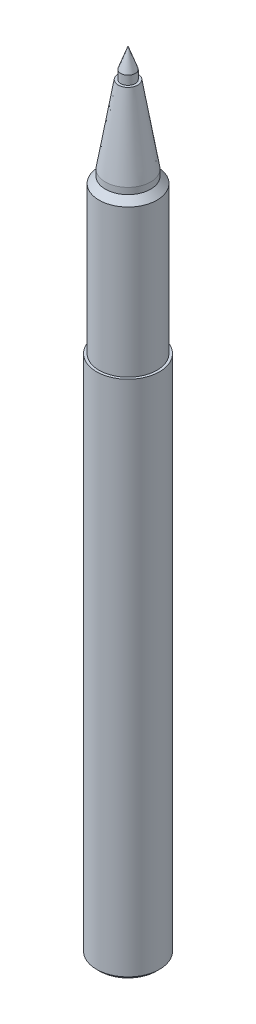
ISO-10303-21;
HEADER;
FILE_DESCRIPTION(('STEP AP214'),'2;1');
FILE_NAME('part.step','',(''),(''),'','','');
FILE_SCHEMA(('AUTOMOTIVE_DESIGN { 1 0 10303 214 1 1 1 1 }'));
ENDSEC;
DATA;
#1=APPLICATION_CONTEXT('core data for automotive mechanical design processes');
#2=APPLICATION_PROTOCOL_DEFINITION('international standard','automotive_design',2000,#1);
#3=PRODUCT_CONTEXT('',#1,'mechanical');
#4=PRODUCT('Part','Part','',(#3));
#5=PRODUCT_RELATED_PRODUCT_CATEGORY('part','',(#4));
#6=PRODUCT_DEFINITION_FORMATION('','',#4);
#7=PRODUCT_DEFINITION_CONTEXT('part definition',#1,'design');
#8=PRODUCT_DEFINITION('design','',#6,#7);
#9=PRODUCT_DEFINITION_SHAPE('','',#8);
#10=(LENGTH_UNIT() NAMED_UNIT(*) SI_UNIT(.MILLI.,.METRE.));
#11=(NAMED_UNIT(*) PLANE_ANGLE_UNIT() SI_UNIT($,.RADIAN.));
#12=(NAMED_UNIT(*) SI_UNIT($,.STERADIAN.) SOLID_ANGLE_UNIT());
#13=UNCERTAINTY_MEASURE_WITH_UNIT(LENGTH_MEASURE(1.E-05),#10,'distance_accuracy_value','');
#14=(GEOMETRIC_REPRESENTATION_CONTEXT(3) GLOBAL_UNCERTAINTY_ASSIGNED_CONTEXT((#13)) GLOBAL_UNIT_ASSIGNED_CONTEXT((#10,
#11,#12)) REPRESENTATION_CONTEXT('',''));
#15=CARTESIAN_POINT('',(0.,0.,0.));
#16=DIRECTION('',(0.,0.,1.));
#17=DIRECTION('',(1.,0.,0.));
#18=AXIS2_PLACEMENT_3D('',#15,#16,#17);
#19=CARTESIAN_POINT('',(-3.9241122024751E-13,114.397298964295,0.));
#20=DIRECTION('',(0.,-1.,0.));
#21=DIRECTION('',(1.,0.,0.));
#22=AXIS2_PLACEMENT_3D('',#19,#20,#21);
#23=CONICAL_SURFACE('',#22,4.16333634234434E-13,0.34500217720683);
#24=CARTESIAN_POINT('',(-3.81434423451072E-13,111.197298964294,0.));
#25=DIRECTION('',(0.,-1.,0.));
#26=DIRECTION('',(1.,0.,0.));
#27=AXIS2_PLACEMENT_3D('',#24,#25,#26);
#28=CIRCLE('',#27,1.14999999999962);
#29=CARTESIAN_POINT('',(1.14999999999923,111.197298964294,0.));
#30=VERTEX_POINT('',#29);
#31=EDGE_CURVE('E115',#30,#30,#28,.T.);
#32=ORIENTED_EDGE('',*,*,#31,.F.);
#33=EDGE_LOOP('',(#32));
#34=FACE_BOUND('',#33,.T.);
#35=CARTESIAN_POINT('',(-3.92411220247298E-13,114.397298964294,0.));
#36=VERTEX_POINT('',#35);
#37=VERTEX_LOOP('',#36);
#38=FACE_BOUND('',#37,.T.);
#39=ADVANCED_FACE('F53',(#34,#38),#23,.T.);
#40=CARTESIAN_POINT('',(1.46426171075191E-11,-4268.67469745649,0.));
#41=DIRECTION('',(0.,-1.,0.));
#42=DIRECTION('',(1.,0.,0.));
#43=AXIS2_PLACEMENT_3D('',#40,#41,#42);
#44=CYLINDRICAL_SURFACE('',#43,1.14999999999962);
#45=CARTESIAN_POINT('',(-3.76632074852633E-13,109.797298964294,0.));
#46=DIRECTION('',(0.,-1.,0.));
#47=DIRECTION('',(1.,0.,0.));
#48=AXIS2_PLACEMENT_3D('',#45,#46,#47);
#49=CIRCLE('',#48,1.14999999999962);
#50=CARTESIAN_POINT('',(1.14999999999925,109.797298964294,0.));
#51=VERTEX_POINT('',#50);
#52=EDGE_CURVE('E118',#51,#51,#49,.T.);
#53=ORIENTED_EDGE('',*,*,#52,.F.);
#54=EDGE_LOOP('',(#53));
#55=FACE_BOUND('',#54,.T.);
#56=ORIENTED_EDGE('',*,*,#31,.T.);
#57=EDGE_LOOP('',(#56));
#58=FACE_BOUND('',#57,.T.);
#59=ADVANCED_FACE('F66',(#55,#58),#44,.T.);
#60=CARTESIAN_POINT('',(-1.15,109.797298964294,0.));
#61=DIRECTION('',(0.,-1.,0.));
#62=DIRECTION('',(1.,0.,0.));
#63=AXIS2_PLACEMENT_3D('',#60,#61,#62);
#64=PLANE('',#63);
#65=CARTESIAN_POINT('',(-3.76632074852633E-13,109.797298964294,0.));
#66=DIRECTION('',(0.,-1.,0.));
#67=DIRECTION('',(1.,0.,0.));
#68=AXIS2_PLACEMENT_3D('',#65,#66,#67);
#69=CIRCLE('',#68,1.54999999999962);
#70=CARTESIAN_POINT('',(1.54999999999925,109.797298964294,0.));
#71=VERTEX_POINT('',#70);
#72=EDGE_CURVE('E124',#71,#71,#69,.T.);
#73=ORIENTED_EDGE('',*,*,#72,.F.);
#74=EDGE_LOOP('',(#73));
#75=FACE_BOUND('',#74,.T.);
#76=ORIENTED_EDGE('',*,*,#52,.T.);
#77=EDGE_LOOP('',(#76));
#78=FACE_BOUND('',#77,.T.);
#79=ADVANCED_FACE('F71',(#75,#78),#64,.F.);
#80=CARTESIAN_POINT('',(-3.76632074852633E-13,109.797298964294,0.));
#81=DIRECTION('',(0.,-1.,0.));
#82=DIRECTION('',(1.,0.,0.));
#83=AXIS2_PLACEMENT_3D('',#80,#81,#82);
#84=CONICAL_SURFACE('',#83,1.54999999999962,0.165148677414633);
#85=CARTESIAN_POINT('',(-3.34440012166339E-13,97.4972989642939,0.));
#86=DIRECTION('',(0.,-1.,0.));
#87=DIRECTION('',(1.,0.,0.));
#88=AXIS2_PLACEMENT_3D('',#85,#86,#87);
#89=CIRCLE('',#88,3.59999999999966);
#90=CARTESIAN_POINT('',(3.59999999999933,97.4972989642939,0.));
#91=VERTEX_POINT('',#90);
#92=EDGE_CURVE('E128',#91,#91,#89,.T.);
#93=ORIENTED_EDGE('',*,*,#92,.F.);
#94=EDGE_LOOP('',(#93));
#95=FACE_BOUND('',#94,.T.);
#96=ORIENTED_EDGE('',*,*,#72,.T.);
#97=EDGE_LOOP('',(#96));
#98=FACE_BOUND('',#97,.T.);
#99=ADVANCED_FACE('F78',(#95,#98),#84,.T.);
#100=CARTESIAN_POINT('',(1.46426171075191E-11,-4268.67469745649,0.));
#101=DIRECTION('',(0.,-1.,0.));
#102=DIRECTION('',(1.,0.,0.));
#103=AXIS2_PLACEMENT_3D('',#100,#101,#102);
#104=CYLINDRICAL_SURFACE('',#103,3.59999999999966);
#105=CARTESIAN_POINT('',(-3.31009763167455E-13,96.4972989642945,0.));
#106=DIRECTION('',(0.,-1.,0.));
#107=DIRECTION('',(1.,0.,0.));
#108=AXIS2_PLACEMENT_3D('',#105,#106,#107);
#109=CIRCLE('',#108,3.59999999999967);
#110=CARTESIAN_POINT('',(3.59999999999934,96.4972989642945,0.));
#111=VERTEX_POINT('',#110);
#112=EDGE_CURVE('E132',#111,#111,#109,.T.);
#113=ORIENTED_EDGE('',*,*,#112,.F.);
#114=EDGE_LOOP('',(#113));
#115=FACE_BOUND('',#114,.T.);
#116=ORIENTED_EDGE('',*,*,#92,.T.);
#117=EDGE_LOOP('',(#116));
#118=FACE_BOUND('',#117,.T.);
#119=ADVANCED_FACE('F82',(#115,#118),#104,.T.);
#120=CARTESIAN_POINT('',(-3.31009763167455E-13,96.4972989642945,0.));
#121=DIRECTION('',(0.,-1.,0.));
#122=DIRECTION('',(1.,0.,0.));
#123=AXIS2_PLACEMENT_3D('',#120,#121,#122);
#124=CONICAL_SURFACE('',#123,3.59999999999967,0.785398163397283);
#125=CARTESIAN_POINT('',(-3.27579514168567E-13,95.4972989642941,0.));
#126=DIRECTION('',(0.,-1.,0.));
#127=DIRECTION('',(1.,0.,0.));
#128=AXIS2_PLACEMENT_3D('',#125,#126,#127);
#129=CIRCLE('',#128,4.59999999999967);
#130=CARTESIAN_POINT('',(4.59999999999934,95.4972989642942,0.));
#131=VERTEX_POINT('',#130);
#132=EDGE_CURVE('E136',#131,#131,#129,.T.);
#133=ORIENTED_EDGE('',*,*,#132,.F.);
#134=EDGE_LOOP('',(#133));
#135=FACE_BOUND('',#134,.T.);
#136=ORIENTED_EDGE('',*,*,#112,.T.);
#137=EDGE_LOOP('',(#136));
#138=FACE_BOUND('',#137,.T.);
#139=ADVANCED_FACE('F86',(#135,#138),#124,.T.);
#140=CARTESIAN_POINT('',(1.46426171075191E-11,-4268.67469745649,0.));
#141=DIRECTION('',(0.,-1.,0.));
#142=DIRECTION('',(1.,0.,0.));
#143=AXIS2_PLACEMENT_3D('',#140,#141,#142);
#144=CYLINDRICAL_SURFACE('',#143,4.59999999999971);
#145=CARTESIAN_POINT('',(-2.47311687594642E-13,72.0972989642945,0.));
#146=DIRECTION('',(0.,-1.,0.));
#147=DIRECTION('',(1.,0.,0.));
#148=AXIS2_PLACEMENT_3D('',#145,#146,#147);
#149=CIRCLE('',#148,4.59999999999975);
#150=CARTESIAN_POINT('',(4.5999999999995,72.0972989642945,0.));
#151=VERTEX_POINT('',#150);
#152=EDGE_CURVE('E140',#151,#151,#149,.T.);
#153=ORIENTED_EDGE('',*,*,#152,.F.);
#154=EDGE_LOOP('',(#153));
#155=FACE_BOUND('',#154,.T.);
#156=ORIENTED_EDGE('',*,*,#132,.T.);
#157=EDGE_LOOP('',(#156));
#158=FACE_BOUND('',#157,.T.);
#159=ADVANCED_FACE('F90',(#155,#158),#144,.T.);
#160=CARTESIAN_POINT('',(-4.59999999999999,72.0972989642941,0.));
#161=DIRECTION('',(0.,-1.,0.));
#162=DIRECTION('',(1.,0.,0.));
#163=AXIS2_PLACEMENT_3D('',#160,#161,#162);
#164=PLANE('',#163);
#165=CARTESIAN_POINT('',(-2.47311687594642E-13,72.0972989642945,0.));
#166=DIRECTION('',(0.,-1.,0.));
#167=DIRECTION('',(1.,0.,0.));
#168=AXIS2_PLACEMENT_3D('',#165,#166,#167);
#169=CIRCLE('',#168,4.99999999999975);
#170=CARTESIAN_POINT('',(4.9999999999995,72.0972989642945,0.));
#171=VERTEX_POINT('',#170);
#172=EDGE_CURVE('E144',#171,#171,#169,.T.);
#173=ORIENTED_EDGE('',*,*,#172,.F.);
#174=EDGE_LOOP('',(#173));
#175=FACE_BOUND('',#174,.T.);
#176=ORIENTED_EDGE('',*,*,#152,.T.);
#177=EDGE_LOOP('',(#176));
#178=FACE_BOUND('',#177,.T.);
#179=ADVANCED_FACE('F94',(#175,#178),#164,.F.);
#180=CARTESIAN_POINT('',(1.46426171075191E-11,-4268.67469745649,0.));
#181=DIRECTION('',(0.,-1.,0.));
#182=DIRECTION('',(1.,0.,0.));
#183=AXIS2_PLACEMENT_3D('',#180,#181,#182);
#184=CYLINDRICAL_SURFACE('',#183,4.99999999999988);
#185=CARTESIAN_POINT('',(0.,-10.1027010357058,0.));
#186=DIRECTION('',(0.,1.,0.));
#187=DIRECTION('',(-1.,0.,0.));
#188=AXIS2_PLACEMENT_3D('',#185,#186,#187);
#189=CIRCLE('',#188,4.99999999999988);
#190=CARTESIAN_POINT('',(-4.99999999999985,-10.1027010357058,0.));
#191=VERTEX_POINT('',#190);
#192=EDGE_CURVE('E11',#191,#191,#189,.T.);
#193=ORIENTED_EDGE('',*,*,#192,.T.);
#194=EDGE_LOOP('',(#193));
#195=FACE_BOUND('',#194,.T.);
#196=ORIENTED_EDGE('',*,*,#172,.T.);
#197=EDGE_LOOP('',(#196));
#198=FACE_BOUND('',#197,.T.);
#199=ADVANCED_FACE('F98',(#195,#198),#184,.T.);
#200=CARTESIAN_POINT('',(-4.99999999999998,-10.6027010357059,0.));
#201=DIRECTION('',(0.,1.,0.));
#202=DIRECTION('',(-1.,0.,0.));
#203=AXIS2_PLACEMENT_3D('',#200,#201,#202);
#204=PLANE('',#203);
#205=CARTESIAN_POINT('',(0.,-10.6027010357059,0.));
#206=DIRECTION('',(0.,1.,0.));
#207=DIRECTION('',(-1.,0.,0.));
#208=AXIS2_PLACEMENT_3D('',#205,#206,#207);
#209=CIRCLE('',#208,4.49999999999939);
#210=CARTESIAN_POINT('',(-4.49999999999935,-10.6027010357059,0.));
#211=VERTEX_POINT('',#210);
#212=EDGE_CURVE('E62',#211,#211,#209,.F.);
#213=ORIENTED_EDGE('',*,*,#212,.T.);
#214=EDGE_LOOP('',(#213));
#215=FACE_BOUND('',#214,.T.);
#216=ADVANCED_FACE('F102',(#215),#204,.F.);
#217=CARTESIAN_POINT('',(0.,-10.6027010357055,0.));
#218=DIRECTION('',(0.,1.,0.));
#219=DIRECTION('',(-1.,0.,0.));
#220=AXIS2_PLACEMENT_3D('',#217,#218,#219);
#221=CONICAL_SURFACE('',#220,4.49999999999981,0.785398163397802);
#222=ORIENTED_EDGE('',*,*,#192,.F.);
#223=EDGE_LOOP('',(#222));
#224=FACE_BOUND('',#223,.T.);
#225=ORIENTED_EDGE('',*,*,#212,.F.);
#226=EDGE_LOOP('',(#225));
#227=FACE_BOUND('',#226,.T.);
#228=ADVANCED_FACE('F56',(#224,#227),#221,.T.);
#229=CLOSED_SHELL('',(#39,#59,#79,#99,#119,#139,#159,#179,#199,#216,#228));
#230=MANIFOLD_SOLID_BREP('B2',#229);
#231=ADVANCED_BREP_SHAPE_REPRESENTATION('',(#18,#230),#14);
#232=SHAPE_DEFINITION_REPRESENTATION(#9,#231);
ENDSEC;
END-ISO-10303-21;
